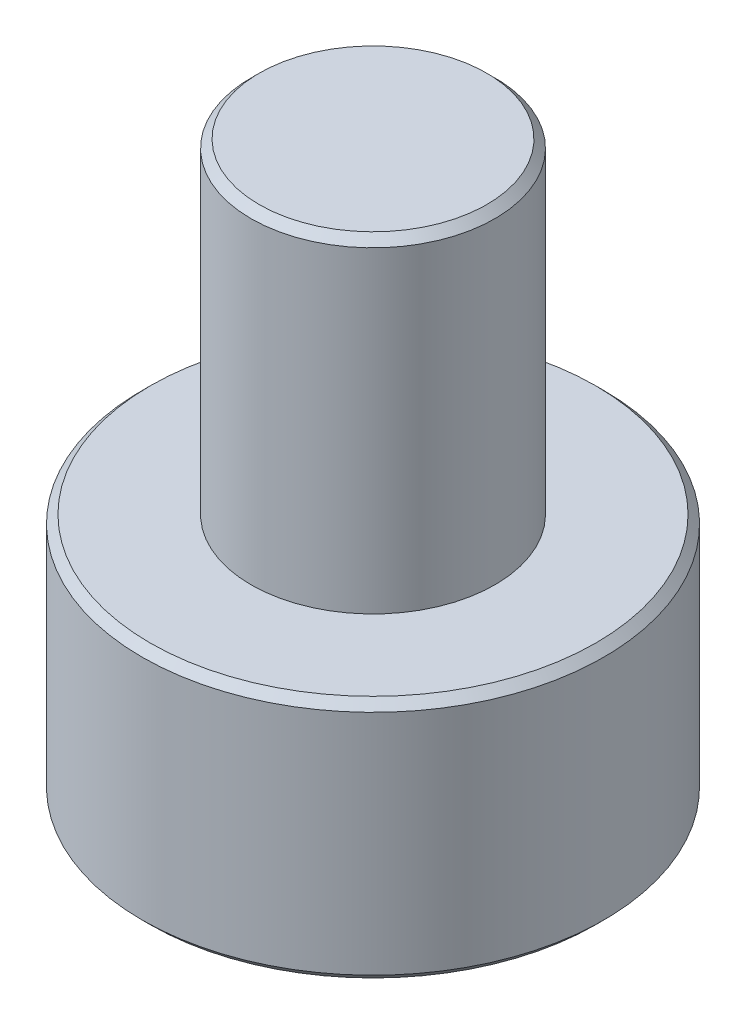
ISO-10303-21;
HEADER;
FILE_DESCRIPTION(('STEP AP214'),'2;1');
FILE_NAME('part.step','',(''),(''),'','','');
FILE_SCHEMA(('AUTOMOTIVE_DESIGN { 1 0 10303 214 1 1 1 1 }'));
ENDSEC;
DATA;
#1=APPLICATION_CONTEXT('core data for automotive mechanical design processes');
#2=APPLICATION_PROTOCOL_DEFINITION('international standard','automotive_design',2000,#1);
#3=PRODUCT_CONTEXT('',#1,'mechanical');
#4=PRODUCT('Part','Part','',(#3));
#5=PRODUCT_RELATED_PRODUCT_CATEGORY('part','',(#4));
#6=PRODUCT_DEFINITION_FORMATION('','',#4);
#7=PRODUCT_DEFINITION_CONTEXT('part definition',#1,'design');
#8=PRODUCT_DEFINITION('design','',#6,#7);
#9=PRODUCT_DEFINITION_SHAPE('','',#8);
#10=(LENGTH_UNIT() NAMED_UNIT(*) SI_UNIT(.MILLI.,.METRE.));
#11=(NAMED_UNIT(*) PLANE_ANGLE_UNIT() SI_UNIT($,.RADIAN.));
#12=(NAMED_UNIT(*) SI_UNIT($,.STERADIAN.) SOLID_ANGLE_UNIT());
#13=UNCERTAINTY_MEASURE_WITH_UNIT(LENGTH_MEASURE(1.E-05),#10,'distance_accuracy_value','');
#14=(GEOMETRIC_REPRESENTATION_CONTEXT(3) GLOBAL_UNCERTAINTY_ASSIGNED_CONTEXT((#13)) GLOBAL_UNIT_ASSIGNED_CONTEXT((#10,
#11,#12)) REPRESENTATION_CONTEXT('',''));
#15=CARTESIAN_POINT('',(0.,0.,0.));
#16=DIRECTION('',(0.,0.,1.));
#17=DIRECTION('',(1.,0.,0.));
#18=AXIS2_PLACEMENT_3D('',#15,#16,#17);
#19=CARTESIAN_POINT('',(0.,3.,0.));
#20=DIRECTION('',(0.,-1.,0.));
#21=DIRECTION('',(0.,0.,-1.));
#22=AXIS2_PLACEMENT_3D('',#19,#20,#21);
#23=CYLINDRICAL_SURFACE('',#22,2.84);
#24=CARTESIAN_POINT('',(0.,2.9,0.));
#25=DIRECTION('',(0.,1.,0.));
#26=DIRECTION('',(0.,0.,1.));
#27=AXIS2_PLACEMENT_3D('',#24,#25,#26);
#28=CIRCLE('',#27,2.84);
#29=CARTESIAN_POINT('',(0.,2.9,2.84));
#30=VERTEX_POINT('',#29);
#31=EDGE_CURVE('E43',#30,#30,#28,.F.);
#32=ORIENTED_EDGE('',*,*,#31,.T.);
#33=EDGE_LOOP('',(#32));
#34=FACE_BOUND('',#33,.T.);
#35=CARTESIAN_POINT('',(0.,0.100000000000001,0.));
#36=DIRECTION('',(0.,1.,0.));
#37=DIRECTION('',(0.,0.,1.));
#38=AXIS2_PLACEMENT_3D('',#35,#36,#37);
#39=CIRCLE('',#38,2.84);
#40=CARTESIAN_POINT('',(0.,0.100000000000001,2.84));
#41=VERTEX_POINT('',#40);
#42=EDGE_CURVE('E154',#41,#41,#39,.T.);
#43=ORIENTED_EDGE('',*,*,#42,.T.);
#44=EDGE_LOOP('',(#43));
#45=FACE_BOUND('',#44,.T.);
#46=ADVANCED_FACE('F35',(#34,#45),#23,.T.);
#47=CARTESIAN_POINT('',(0.,3.,0.));
#48=DIRECTION('',(0.,1.,0.));
#49=DIRECTION('',(0.,0.,1.));
#50=AXIS2_PLACEMENT_3D('',#47,#48,#49);
#51=PLANE('',#50);
#52=CARTESIAN_POINT('',(0.,3.,0.));
#53=DIRECTION('',(0.,1.,0.));
#54=DIRECTION('',(0.,0.,1.));
#55=AXIS2_PLACEMENT_3D('',#52,#53,#54);
#56=CIRCLE('',#55,2.74);
#57=CARTESIAN_POINT('',(0.,3.,2.74));
#58=VERTEX_POINT('',#57);
#59=EDGE_CURVE('E151',#58,#58,#56,.T.);
#60=ORIENTED_EDGE('',*,*,#59,.T.);
#61=EDGE_LOOP('',(#60));
#62=FACE_BOUND('',#61,.T.);
#63=CARTESIAN_POINT('',(0.,3.,0.));
#64=DIRECTION('',(0.,1.,0.));
#65=DIRECTION('',(0.,0.,1.));
#66=AXIS2_PLACEMENT_3D('',#63,#64,#65);
#67=CIRCLE('',#66,1.5);
#68=CARTESIAN_POINT('',(0.,3.,1.5));
#69=VERTEX_POINT('',#68);
#70=EDGE_CURVE('E137',#69,#69,#67,.T.);
#71=ORIENTED_EDGE('',*,*,#70,.F.);
#72=EDGE_LOOP('',(#71));
#73=FACE_BOUND('',#72,.T.);
#74=ADVANCED_FACE('F167',(#62,#73),#51,.T.);
#75=CARTESIAN_POINT('',(0.,0.,0.));
#76=DIRECTION('',(0.,1.,0.));
#77=DIRECTION('',(0.,0.,1.));
#78=AXIS2_PLACEMENT_3D('',#75,#76,#77);
#79=PLANE('',#78);
#80=CARTESIAN_POINT('',(0.,0.,0.));
#81=DIRECTION('',(0.,1.,0.));
#82=DIRECTION('',(0.,0.,1.));
#83=AXIS2_PLACEMENT_3D('',#80,#81,#82);
#84=CIRCLE('',#83,2.74);
#85=CARTESIAN_POINT('',(0.,0.,2.74));
#86=VERTEX_POINT('',#85);
#87=EDGE_CURVE('E11',#86,#86,#84,.F.);
#88=ORIENTED_EDGE('',*,*,#87,.T.);
#89=EDGE_LOOP('',(#88));
#90=FACE_BOUND('',#89,.T.);
#91=DIRECTION('',(0.,0.,1.));
#92=VECTOR('',#91,1.);
#93=CARTESIAN_POINT('',(1.29,0.,-0.744781847254618));
#94=LINE('',#93,#92);
#95=CARTESIAN_POINT('',(1.29,0.,-0.744781847254618));
#96=VERTEX_POINT('',#95);
#97=CARTESIAN_POINT('',(1.29,0.,0.744781847254619));
#98=VERTEX_POINT('',#97);
#99=EDGE_CURVE('E124',#96,#98,#94,.T.);
#100=ORIENTED_EDGE('',*,*,#99,.F.);
#101=DIRECTION('',(0.866025403784439,0.,0.5));
#102=VECTOR('',#101,1.);
#103=CARTESIAN_POINT('',(0.,0.,-1.48956369450924));
#104=LINE('',#103,#102);
#105=CARTESIAN_POINT('',(0.,0.,-1.48956369450924));
#106=VERTEX_POINT('',#105);
#107=EDGE_CURVE('E50',#106,#96,#104,.T.);
#108=ORIENTED_EDGE('',*,*,#107,.F.);
#109=DIRECTION('',(0.866025403784439,0.,-0.5));
#110=VECTOR('',#109,1.);
#111=CARTESIAN_POINT('',(-1.29,0.,-0.744781847254618));
#112=LINE('',#111,#110);
#113=CARTESIAN_POINT('',(-1.29,0.,-0.744781847254618));
#114=VERTEX_POINT('',#113);
#115=EDGE_CURVE('E133',#114,#106,#112,.T.);
#116=ORIENTED_EDGE('',*,*,#115,.F.);
#117=DIRECTION('',(0.,0.,-1.));
#118=VECTOR('',#117,1.);
#119=CARTESIAN_POINT('',(-1.29,0.,0.744781847254619));
#120=LINE('',#119,#118);
#121=CARTESIAN_POINT('',(-1.29,0.,0.744781847254619));
#122=VERTEX_POINT('',#121);
#123=EDGE_CURVE('E131',#122,#114,#120,.T.);
#124=ORIENTED_EDGE('',*,*,#123,.F.);
#125=DIRECTION('',(-0.866025403784439,0.,-0.5));
#126=VECTOR('',#125,1.);
#127=CARTESIAN_POINT('',(0.,0.,1.48956369450924));
#128=LINE('',#127,#126);
#129=CARTESIAN_POINT('',(0.,0.,1.48956369450924));
#130=VERTEX_POINT('',#129);
#131=EDGE_CURVE('E98',#130,#122,#128,.T.);
#132=ORIENTED_EDGE('',*,*,#131,.F.);
#133=DIRECTION('',(-0.866025403784439,0.,0.5));
#134=VECTOR('',#133,1.);
#135=CARTESIAN_POINT('',(1.29,0.,0.744781847254619));
#136=LINE('',#135,#134);
#137=EDGE_CURVE('E127',#98,#130,#136,.T.);
#138=ORIENTED_EDGE('',*,*,#137,.F.);
#139=EDGE_LOOP('',(#100,#108,#116,#124,#132,#138));
#140=FACE_BOUND('',#139,.T.);
#141=ADVANCED_FACE('F170',(#90,#140),#79,.F.);
#142=CARTESIAN_POINT('',(0.,7.,0.));
#143=DIRECTION('',(0.,-1.,0.));
#144=DIRECTION('',(0.,0.,-1.));
#145=AXIS2_PLACEMENT_3D('',#142,#143,#144);
#146=CYLINDRICAL_SURFACE('',#145,1.5);
#147=CARTESIAN_POINT('',(0.,6.9,0.));
#148=DIRECTION('',(0.,1.,0.));
#149=DIRECTION('',(0.,0.,1.));
#150=AXIS2_PLACEMENT_3D('',#147,#148,#149);
#151=CIRCLE('',#150,1.5);
#152=CARTESIAN_POINT('',(0.,6.9,1.5));
#153=VERTEX_POINT('',#152);
#154=EDGE_CURVE('E148',#153,#153,#151,.F.);
#155=ORIENTED_EDGE('',*,*,#154,.T.);
#156=EDGE_LOOP('',(#155));
#157=FACE_BOUND('',#156,.T.);
#158=ORIENTED_EDGE('',*,*,#70,.T.);
#159=EDGE_LOOP('',(#158));
#160=FACE_BOUND('',#159,.T.);
#161=ADVANCED_FACE('F174',(#157,#160),#146,.T.);
#162=CARTESIAN_POINT('',(0.,7.,0.));
#163=DIRECTION('',(0.,1.,0.));
#164=DIRECTION('',(0.,0.,1.));
#165=AXIS2_PLACEMENT_3D('',#162,#163,#164);
#166=PLANE('',#165);
#167=CARTESIAN_POINT('',(0.,7.,0.));
#168=DIRECTION('',(0.,1.,0.));
#169=DIRECTION('',(0.,0.,1.));
#170=AXIS2_PLACEMENT_3D('',#167,#168,#169);
#171=CIRCLE('',#170,1.4);
#172=CARTESIAN_POINT('',(0.,7.,1.4));
#173=VERTEX_POINT('',#172);
#174=EDGE_CURVE('E145',#173,#173,#171,.T.);
#175=ORIENTED_EDGE('',*,*,#174,.T.);
#176=EDGE_LOOP('',(#175));
#177=FACE_BOUND('',#176,.T.);
#178=ADVANCED_FACE('F176',(#177),#166,.T.);
#179=CARTESIAN_POINT('',(0.,1.3,-1.48956369450924));
#180=DIRECTION('',(0.5,0.,-0.866025403784439));
#181=DIRECTION('',(-0.866025403784439,0.,-0.5));
#182=AXIS2_PLACEMENT_3D('',#179,#180,#181);
#183=PLANE('',#182);
#184=ORIENTED_EDGE('',*,*,#107,.T.);
#185=DIRECTION('',(0.,-1.,0.));
#186=VECTOR('',#185,1.);
#187=CARTESIAN_POINT('',(1.29,1.3,-0.744781847254618));
#188=LINE('',#187,#186);
#189=CARTESIAN_POINT('',(1.29,1.3,-0.744781847254618));
#190=VERTEX_POINT('',#189);
#191=EDGE_CURVE('E80',#190,#96,#188,.T.);
#192=ORIENTED_EDGE('',*,*,#191,.F.);
#193=DIRECTION('',(0.866025403784439,0.,0.5));
#194=VECTOR('',#193,1.);
#195=CARTESIAN_POINT('',(0.,1.3,-1.48956369450924));
#196=LINE('',#195,#194);
#197=CARTESIAN_POINT('',(0.,1.3,-1.48956369450924));
#198=VERTEX_POINT('',#197);
#199=EDGE_CURVE('E135',#198,#190,#196,.T.);
#200=ORIENTED_EDGE('',*,*,#199,.F.);
#201=DIRECTION('',(0.,-1.,0.));
#202=VECTOR('',#201,1.);
#203=CARTESIAN_POINT('',(0.,1.3,-1.48956369450924));
#204=LINE('',#203,#202);
#205=EDGE_CURVE('E58',#198,#106,#204,.T.);
#206=ORIENTED_EDGE('',*,*,#205,.T.);
#207=EDGE_LOOP('',(#184,#192,#200,#206));
#208=FACE_BOUND('',#207,.T.);
#209=ADVANCED_FACE('F183',(#208),#183,.F.);
#210=CARTESIAN_POINT('',(-1.29,1.3,-0.744781847254618));
#211=DIRECTION('',(-0.5,0.,-0.866025403784439));
#212=DIRECTION('',(-0.866025403784439,0.,0.5));
#213=AXIS2_PLACEMENT_3D('',#210,#211,#212);
#214=PLANE('',#213);
#215=ORIENTED_EDGE('',*,*,#115,.T.);
#216=ORIENTED_EDGE('',*,*,#205,.F.);
#217=DIRECTION('',(0.866025403784439,0.,-0.5));
#218=VECTOR('',#217,1.);
#219=CARTESIAN_POINT('',(-1.29,1.3,-0.744781847254618));
#220=LINE('',#219,#218);
#221=CARTESIAN_POINT('',(-1.29,1.3,-0.744781847254618));
#222=VERTEX_POINT('',#221);
#223=EDGE_CURVE('E110',#222,#198,#220,.T.);
#224=ORIENTED_EDGE('',*,*,#223,.F.);
#225=DIRECTION('',(0.,-1.,0.));
#226=VECTOR('',#225,1.);
#227=CARTESIAN_POINT('',(-1.29,1.3,-0.744781847254618));
#228=LINE('',#227,#226);
#229=EDGE_CURVE('E102',#222,#114,#228,.T.);
#230=ORIENTED_EDGE('',*,*,#229,.T.);
#231=EDGE_LOOP('',(#215,#216,#224,#230));
#232=FACE_BOUND('',#231,.T.);
#233=ADVANCED_FACE('F210',(#232),#214,.F.);
#234=CARTESIAN_POINT('',(-1.29,1.3,0.744781847254619));
#235=DIRECTION('',(-1.,0.,0.));
#236=DIRECTION('',(0.,0.,1.));
#237=AXIS2_PLACEMENT_3D('',#234,#235,#236);
#238=PLANE('',#237);
#239=ORIENTED_EDGE('',*,*,#123,.T.);
#240=ORIENTED_EDGE('',*,*,#229,.F.);
#241=DIRECTION('',(0.,0.,-1.));
#242=VECTOR('',#241,1.);
#243=CARTESIAN_POINT('',(-1.29,1.3,0.744781847254619));
#244=LINE('',#243,#242);
#245=CARTESIAN_POINT('',(-1.29,1.3,0.744781847254619));
#246=VERTEX_POINT('',#245);
#247=EDGE_CURVE('E106',#246,#222,#244,.T.);
#248=ORIENTED_EDGE('',*,*,#247,.F.);
#249=DIRECTION('',(0.,-1.,0.));
#250=VECTOR('',#249,1.);
#251=CARTESIAN_POINT('',(-1.29,1.3,0.744781847254619));
#252=LINE('',#251,#250);
#253=EDGE_CURVE('E91',#246,#122,#252,.T.);
#254=ORIENTED_EDGE('',*,*,#253,.T.);
#255=EDGE_LOOP('',(#239,#240,#248,#254));
#256=FACE_BOUND('',#255,.T.);
#257=ADVANCED_FACE('F107',(#256),#238,.F.);
#258=CARTESIAN_POINT('',(0.,1.3,1.48956369450924));
#259=DIRECTION('',(-0.5,0.,0.866025403784439));
#260=DIRECTION('',(0.866025403784439,0.,0.5));
#261=AXIS2_PLACEMENT_3D('',#258,#259,#260);
#262=PLANE('',#261);
#263=ORIENTED_EDGE('',*,*,#131,.T.);
#264=ORIENTED_EDGE('',*,*,#253,.F.);
#265=DIRECTION('',(-0.866025403784439,0.,-0.5));
#266=VECTOR('',#265,1.);
#267=CARTESIAN_POINT('',(0.,1.3,1.48956369450924));
#268=LINE('',#267,#266);
#269=CARTESIAN_POINT('',(0.,1.3,1.48956369450924));
#270=VERTEX_POINT('',#269);
#271=EDGE_CURVE('E95',#270,#246,#268,.T.);
#272=ORIENTED_EDGE('',*,*,#271,.F.);
#273=DIRECTION('',(0.,-1.,0.));
#274=VECTOR('',#273,1.);
#275=CARTESIAN_POINT('',(0.,1.3,1.48956369450924));
#276=LINE('',#275,#274);
#277=EDGE_CURVE('E103',#270,#130,#276,.T.);
#278=ORIENTED_EDGE('',*,*,#277,.T.);
#279=EDGE_LOOP('',(#263,#264,#272,#278));
#280=FACE_BOUND('',#279,.T.);
#281=ADVANCED_FACE('F93',(#280),#262,.F.);
#282=CARTESIAN_POINT('',(1.29,1.3,0.744781847254619));
#283=DIRECTION('',(0.5,0.,0.866025403784439));
#284=DIRECTION('',(0.866025403784439,0.,-0.5));
#285=AXIS2_PLACEMENT_3D('',#282,#283,#284);
#286=PLANE('',#285);
#287=ORIENTED_EDGE('',*,*,#137,.T.);
#288=ORIENTED_EDGE('',*,*,#277,.F.);
#289=DIRECTION('',(-0.866025403784439,0.,0.5));
#290=VECTOR('',#289,1.);
#291=CARTESIAN_POINT('',(1.29,1.3,0.744781847254619));
#292=LINE('',#291,#290);
#293=CARTESIAN_POINT('',(1.29,1.3,0.744781847254619));
#294=VERTEX_POINT('',#293);
#295=EDGE_CURVE('E116',#294,#270,#292,.T.);
#296=ORIENTED_EDGE('',*,*,#295,.F.);
#297=DIRECTION('',(0.,-1.,0.));
#298=VECTOR('',#297,1.);
#299=CARTESIAN_POINT('',(1.29,1.3,0.744781847254619));
#300=LINE('',#299,#298);
#301=EDGE_CURVE('E140',#294,#98,#300,.T.);
#302=ORIENTED_EDGE('',*,*,#301,.T.);
#303=EDGE_LOOP('',(#287,#288,#296,#302));
#304=FACE_BOUND('',#303,.T.);
#305=ADVANCED_FACE('F206',(#304),#286,.F.);
#306=CARTESIAN_POINT('',(1.29,1.3,-0.744781847254618));
#307=DIRECTION('',(1.,0.,0.));
#308=DIRECTION('',(0.,0.,-1.));
#309=AXIS2_PLACEMENT_3D('',#306,#307,#308);
#310=PLANE('',#309);
#311=ORIENTED_EDGE('',*,*,#99,.T.);
#312=ORIENTED_EDGE('',*,*,#301,.F.);
#313=DIRECTION('',(0.,0.,1.));
#314=VECTOR('',#313,1.);
#315=CARTESIAN_POINT('',(1.29,1.3,-0.744781847254618));
#316=LINE('',#315,#314);
#317=EDGE_CURVE('E118',#190,#294,#316,.T.);
#318=ORIENTED_EDGE('',*,*,#317,.F.);
#319=ORIENTED_EDGE('',*,*,#191,.T.);
#320=EDGE_LOOP('',(#311,#312,#318,#319));
#321=FACE_BOUND('',#320,.T.);
#322=ADVANCED_FACE('F198',(#321),#310,.F.);
#323=CARTESIAN_POINT('',(0.,1.3,0.));
#324=DIRECTION('',(0.,-1.,0.));
#325=DIRECTION('',(0.,0.,-1.));
#326=AXIS2_PLACEMENT_3D('',#323,#324,#325);
#327=PLANE('',#326);
#328=ORIENTED_EDGE('',*,*,#199,.T.);
#329=ORIENTED_EDGE('',*,*,#317,.T.);
#330=ORIENTED_EDGE('',*,*,#295,.T.);
#331=ORIENTED_EDGE('',*,*,#271,.T.);
#332=ORIENTED_EDGE('',*,*,#247,.T.);
#333=ORIENTED_EDGE('',*,*,#223,.T.);
#334=EDGE_LOOP('',(#328,#329,#330,#331,#332,#333));
#335=FACE_BOUND('',#334,.T.);
#336=ADVANCED_FACE('F113',(#335),#327,.T.);
#337=CARTESIAN_POINT('',(0.,7.,0.));
#338=DIRECTION('',(0.,-1.,0.));
#339=DIRECTION('',(0.,0.,-1.));
#340=AXIS2_PLACEMENT_3D('',#337,#338,#339);
#341=CONICAL_SURFACE('',#340,1.4,0.785398163397435);
#342=ORIENTED_EDGE('',*,*,#154,.F.);
#343=EDGE_LOOP('',(#342));
#344=FACE_BOUND('',#343,.T.);
#345=ORIENTED_EDGE('',*,*,#174,.F.);
#346=EDGE_LOOP('',(#345));
#347=FACE_BOUND('',#346,.T.);
#348=ADVANCED_FACE('F164',(#344,#347),#341,.T.);
#349=CARTESIAN_POINT('',(0.,3.,0.));
#350=DIRECTION('',(0.,-1.,0.));
#351=DIRECTION('',(0.,0.,-1.));
#352=AXIS2_PLACEMENT_3D('',#349,#350,#351);
#353=CONICAL_SURFACE('',#352,2.74,0.785398163397444);
#354=ORIENTED_EDGE('',*,*,#31,.F.);
#355=EDGE_LOOP('',(#354));
#356=FACE_BOUND('',#355,.T.);
#357=ORIENTED_EDGE('',*,*,#59,.F.);
#358=EDGE_LOOP('',(#357));
#359=FACE_BOUND('',#358,.T.);
#360=ADVANCED_FACE('F161',(#356,#359),#353,.T.);
#361=CARTESIAN_POINT('',(0.,0.100000000000001,0.));
#362=DIRECTION('',(0.,1.,0.));
#363=DIRECTION('',(0.,0.,1.));
#364=AXIS2_PLACEMENT_3D('',#361,#362,#363);
#365=CONICAL_SURFACE('',#364,2.84,0.78539816339745);
#366=ORIENTED_EDGE('',*,*,#87,.F.);
#367=EDGE_LOOP('',(#366));
#368=FACE_BOUND('',#367,.T.);
#369=ORIENTED_EDGE('',*,*,#42,.F.);
#370=EDGE_LOOP('',(#369));
#371=FACE_BOUND('',#370,.T.);
#372=ADVANCED_FACE('F37',(#368,#371),#365,.T.);
#373=CLOSED_SHELL('',(#46,#74,#141,#161,#178,#209,#233,#257,#281,#305,#322,#336,#348,#360,#372));
#374=MANIFOLD_SOLID_BREP('B2',#373);
#375=ADVANCED_BREP_SHAPE_REPRESENTATION('',(#18,#374),#14);
#376=SHAPE_DEFINITION_REPRESENTATION(#9,#375);
ENDSEC;
END-ISO-10303-21;
